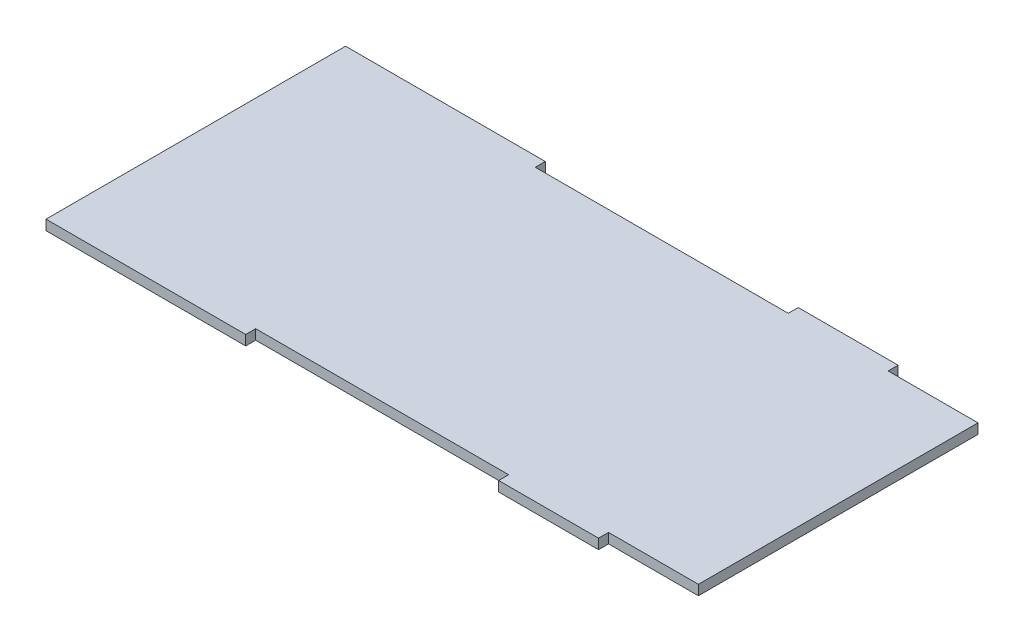
ISO-10303-21;
HEADER;
FILE_DESCRIPTION(('STEP AP214'),'2;1');
FILE_NAME('part.step','',(''),(''),'','','');
FILE_SCHEMA(('AUTOMOTIVE_DESIGN { 1 0 10303 214 1 1 1 1 }'));
ENDSEC;
DATA;
#1=APPLICATION_CONTEXT('core data for automotive mechanical design processes');
#2=APPLICATION_PROTOCOL_DEFINITION('international standard','automotive_design',2000,#1);
#3=PRODUCT_CONTEXT('',#1,'mechanical');
#4=PRODUCT('Part','Part','',(#3));
#5=PRODUCT_RELATED_PRODUCT_CATEGORY('part','',(#4));
#6=PRODUCT_DEFINITION_FORMATION('','',#4);
#7=PRODUCT_DEFINITION_CONTEXT('part definition',#1,'design');
#8=PRODUCT_DEFINITION('design','',#6,#7);
#9=PRODUCT_DEFINITION_SHAPE('','',#8);
#10=(LENGTH_UNIT() NAMED_UNIT(*) SI_UNIT(.MILLI.,.METRE.));
#11=(NAMED_UNIT(*) PLANE_ANGLE_UNIT() SI_UNIT($,.RADIAN.));
#12=(NAMED_UNIT(*) SI_UNIT($,.STERADIAN.) SOLID_ANGLE_UNIT());
#13=UNCERTAINTY_MEASURE_WITH_UNIT(LENGTH_MEASURE(1.E-05),#10,'distance_accuracy_value','');
#14=(GEOMETRIC_REPRESENTATION_CONTEXT(3) GLOBAL_UNCERTAINTY_ASSIGNED_CONTEXT((#13)) GLOBAL_UNIT_ASSIGNED_CONTEXT((#10,
#11,#12)) REPRESENTATION_CONTEXT('',''));
#15=CARTESIAN_POINT('',(0.,0.,0.));
#16=DIRECTION('',(0.,0.,1.));
#17=DIRECTION('',(1.,0.,0.));
#18=AXIS2_PLACEMENT_3D('',#15,#16,#17);
#19=CARTESIAN_POINT('',(68.,3.,0.));
#20=DIRECTION('',(-1.,0.,0.));
#21=DIRECTION('',(0.,0.,1.));
#22=AXIS2_PLACEMENT_3D('',#19,#20,#21);
#23=PLANE('',#22);
#24=DIRECTION('',(0.,0.,-1.));
#25=VECTOR('',#24,1.);
#26=CARTESIAN_POINT('',(68.,0.,0.));
#27=LINE('',#26,#25);
#28=CARTESIAN_POINT('',(68.,0.,45.));
#29=VERTEX_POINT('',#28);
#30=CARTESIAN_POINT('',(68.,0.,42.));
#31=VERTEX_POINT('',#30);
#32=EDGE_CURVE('E180',#29,#31,#27,.T.);
#33=ORIENTED_EDGE('',*,*,#32,.T.);
#34=DIRECTION('',(0.,-1.,0.));
#35=VECTOR('',#34,1.);
#36=CARTESIAN_POINT('',(68.,3.,42.));
#37=LINE('',#36,#35);
#38=CARTESIAN_POINT('',(68.,3.,42.));
#39=VERTEX_POINT('',#38);
#40=EDGE_CURVE('E11',#39,#31,#37,.T.);
#41=ORIENTED_EDGE('',*,*,#40,.F.);
#42=DIRECTION('',(0.,0.,-1.));
#43=VECTOR('',#42,1.);
#44=CARTESIAN_POINT('',(68.,3.,0.));
#45=LINE('',#44,#43);
#46=CARTESIAN_POINT('',(68.,3.,45.));
#47=VERTEX_POINT('',#46);
#48=EDGE_CURVE('E288',#47,#39,#45,.T.);
#49=ORIENTED_EDGE('',*,*,#48,.F.);
#50=DIRECTION('',(0.,-1.,0.));
#51=VECTOR('',#50,1.);
#52=CARTESIAN_POINT('',(68.,3.,45.));
#53=LINE('',#52,#51);
#54=EDGE_CURVE('E175',#47,#29,#53,.T.);
#55=ORIENTED_EDGE('',*,*,#54,.T.);
#56=EDGE_LOOP('',(#33,#41,#49,#55));
#57=FACE_BOUND('',#56,.T.);
#58=ADVANCED_FACE('F35',(#57),#23,.F.);
#59=CARTESIAN_POINT('',(0.,3.,42.));
#60=DIRECTION('',(0.,0.,-1.));
#61=DIRECTION('',(-1.,0.,0.));
#62=AXIS2_PLACEMENT_3D('',#59,#60,#61);
#63=PLANE('',#62);
#64=DIRECTION('',(1.,0.,0.));
#65=VECTOR('',#64,1.);
#66=CARTESIAN_POINT('',(0.,0.,42.));
#67=LINE('',#66,#65);
#68=CARTESIAN_POINT('',(95.,0.,42.));
#69=VERTEX_POINT('',#68);
#70=EDGE_CURVE('E183',#31,#69,#67,.T.);
#71=ORIENTED_EDGE('',*,*,#70,.T.);
#72=DIRECTION('',(0.,-1.,0.));
#73=VECTOR('',#72,1.);
#74=CARTESIAN_POINT('',(95.,3.,42.));
#75=LINE('',#74,#73);
#76=CARTESIAN_POINT('',(95.,3.,42.));
#77=VERTEX_POINT('',#76);
#78=EDGE_CURVE('E43',#77,#69,#75,.T.);
#79=ORIENTED_EDGE('',*,*,#78,.F.);
#80=DIRECTION('',(1.,0.,0.));
#81=VECTOR('',#80,1.);
#82=CARTESIAN_POINT('',(0.,3.,42.));
#83=LINE('',#82,#81);
#84=EDGE_CURVE('E118',#39,#77,#83,.T.);
#85=ORIENTED_EDGE('',*,*,#84,.F.);
#86=ORIENTED_EDGE('',*,*,#40,.T.);
#87=EDGE_LOOP('',(#71,#79,#85,#86));
#88=FACE_BOUND('',#87,.T.);
#89=ADVANCED_FACE('F294',(#88),#63,.F.);
#90=CARTESIAN_POINT('',(95.,3.,0.));
#91=DIRECTION('',(-1.,0.,0.));
#92=DIRECTION('',(0.,0.,1.));
#93=AXIS2_PLACEMENT_3D('',#90,#91,#92);
#94=PLANE('',#93);
#95=DIRECTION('',(0.,0.,-1.));
#96=VECTOR('',#95,1.);
#97=CARTESIAN_POINT('',(95.,0.,0.));
#98=LINE('',#97,#96);
#99=CARTESIAN_POINT('',(95.,0.,-42.));
#100=VERTEX_POINT('',#99);
#101=EDGE_CURVE('E185',#69,#100,#98,.T.);
#102=ORIENTED_EDGE('',*,*,#101,.T.);
#103=DIRECTION('',(0.,-1.,0.));
#104=VECTOR('',#103,1.);
#105=CARTESIAN_POINT('',(95.,3.,-42.));
#106=LINE('',#105,#104);
#107=CARTESIAN_POINT('',(95.,3.,-42.));
#108=VERTEX_POINT('',#107);
#109=EDGE_CURVE('E237',#108,#100,#106,.T.);
#110=ORIENTED_EDGE('',*,*,#109,.F.);
#111=DIRECTION('',(0.,0.,-1.));
#112=VECTOR('',#111,1.);
#113=CARTESIAN_POINT('',(95.,3.,0.));
#114=LINE('',#113,#112);
#115=EDGE_CURVE('E245',#77,#108,#114,.T.);
#116=ORIENTED_EDGE('',*,*,#115,.F.);
#117=ORIENTED_EDGE('',*,*,#78,.T.);
#118=EDGE_LOOP('',(#102,#110,#116,#117));
#119=FACE_BOUND('',#118,.T.);
#120=ADVANCED_FACE('F243',(#119),#94,.F.);
#121=CARTESIAN_POINT('',(0.,3.,-42.));
#122=DIRECTION('',(0.,0.,1.));
#123=DIRECTION('',(1.,0.,0.));
#124=AXIS2_PLACEMENT_3D('',#121,#122,#123);
#125=PLANE('',#124);
#126=DIRECTION('',(-1.,0.,0.));
#127=VECTOR('',#126,1.);
#128=CARTESIAN_POINT('',(0.,0.,-42.));
#129=LINE('',#128,#127);
#130=CARTESIAN_POINT('',(68.,0.,-42.));
#131=VERTEX_POINT('',#130);
#132=EDGE_CURVE('E187',#100,#131,#129,.T.);
#133=ORIENTED_EDGE('',*,*,#132,.T.);
#134=DIRECTION('',(0.,-1.,0.));
#135=VECTOR('',#134,1.);
#136=CARTESIAN_POINT('',(68.,3.,-42.));
#137=LINE('',#136,#135);
#138=CARTESIAN_POINT('',(68.,3.,-42.));
#139=VERTEX_POINT('',#138);
#140=EDGE_CURVE('E234',#139,#131,#137,.T.);
#141=ORIENTED_EDGE('',*,*,#140,.F.);
#142=DIRECTION('',(-1.,0.,0.));
#143=VECTOR('',#142,1.);
#144=CARTESIAN_POINT('',(0.,3.,-42.));
#145=LINE('',#144,#143);
#146=EDGE_CURVE('E263',#108,#139,#145,.T.);
#147=ORIENTED_EDGE('',*,*,#146,.F.);
#148=ORIENTED_EDGE('',*,*,#109,.T.);
#149=EDGE_LOOP('',(#133,#141,#147,#148));
#150=FACE_BOUND('',#149,.T.);
#151=ADVANCED_FACE('F253',(#150),#125,.F.);
#152=CARTESIAN_POINT('',(68.,3.,0.));
#153=DIRECTION('',(-1.,0.,0.));
#154=DIRECTION('',(0.,0.,1.));
#155=AXIS2_PLACEMENT_3D('',#152,#153,#154);
#156=PLANE('',#155);
#157=DIRECTION('',(0.,0.,-1.));
#158=VECTOR('',#157,1.);
#159=CARTESIAN_POINT('',(68.,0.,0.));
#160=LINE('',#159,#158);
#161=CARTESIAN_POINT('',(68.,0.,-45.));
#162=VERTEX_POINT('',#161);
#163=EDGE_CURVE('E189',#131,#162,#160,.T.);
#164=ORIENTED_EDGE('',*,*,#163,.T.);
#165=DIRECTION('',(0.,-1.,0.));
#166=VECTOR('',#165,1.);
#167=CARTESIAN_POINT('',(68.,3.,-45.));
#168=LINE('',#167,#166);
#169=CARTESIAN_POINT('',(68.,3.,-45.));
#170=VERTEX_POINT('',#169);
#171=EDGE_CURVE('E232',#170,#162,#168,.T.);
#172=ORIENTED_EDGE('',*,*,#171,.F.);
#173=DIRECTION('',(0.,0.,-1.));
#174=VECTOR('',#173,1.);
#175=CARTESIAN_POINT('',(68.,3.,0.));
#176=LINE('',#175,#174);
#177=EDGE_CURVE('E259',#139,#170,#176,.T.);
#178=ORIENTED_EDGE('',*,*,#177,.F.);
#179=ORIENTED_EDGE('',*,*,#140,.T.);
#180=EDGE_LOOP('',(#164,#172,#178,#179));
#181=FACE_BOUND('',#180,.T.);
#182=ADVANCED_FACE('F257',(#181),#156,.F.);
#183=CARTESIAN_POINT('',(0.,3.,-45.));
#184=DIRECTION('',(0.,0.,-1.));
#185=DIRECTION('',(-1.,0.,0.));
#186=AXIS2_PLACEMENT_3D('',#183,#184,#185);
#187=PLANE('',#186);
#188=DIRECTION('',(1.,0.,0.));
#189=VECTOR('',#188,1.);
#190=CARTESIAN_POINT('',(0.,0.,-45.));
#191=LINE('',#190,#189);
#192=CARTESIAN_POINT('',(38.,0.,-45.));
#193=VERTEX_POINT('',#192);
#194=EDGE_CURVE('E192',#193,#162,#191,.T.);
#195=ORIENTED_EDGE('',*,*,#194,.F.);
#196=DIRECTION('',(0.,-1.,0.));
#197=VECTOR('',#196,1.);
#198=CARTESIAN_POINT('',(38.,3.,-45.));
#199=LINE('',#198,#197);
#200=CARTESIAN_POINT('',(38.,3.,-45.));
#201=VERTEX_POINT('',#200);
#202=EDGE_CURVE('E230',#201,#193,#199,.T.);
#203=ORIENTED_EDGE('',*,*,#202,.F.);
#204=DIRECTION('',(1.,0.,0.));
#205=VECTOR('',#204,1.);
#206=CARTESIAN_POINT('',(0.,3.,-45.));
#207=LINE('',#206,#205);
#208=EDGE_CURVE('E262',#201,#170,#207,.T.);
#209=ORIENTED_EDGE('',*,*,#208,.T.);
#210=ORIENTED_EDGE('',*,*,#171,.T.);
#211=EDGE_LOOP('',(#195,#203,#209,#210));
#212=FACE_BOUND('',#211,.T.);
#213=ADVANCED_FACE('F306',(#212),#187,.T.);
#214=CARTESIAN_POINT('',(38.,3.,0.));
#215=DIRECTION('',(1.,0.,0.));
#216=DIRECTION('',(0.,0.,-1.));
#217=AXIS2_PLACEMENT_3D('',#214,#215,#216);
#218=PLANE('',#217);
#219=DIRECTION('',(0.,0.,1.));
#220=VECTOR('',#219,1.);
#221=CARTESIAN_POINT('',(38.,0.,0.));
#222=LINE('',#221,#220);
#223=CARTESIAN_POINT('',(38.,0.,-42.));
#224=VERTEX_POINT('',#223);
#225=EDGE_CURVE('E195',#193,#224,#222,.T.);
#226=ORIENTED_EDGE('',*,*,#225,.T.);
#227=DIRECTION('',(0.,-1.,0.));
#228=VECTOR('',#227,1.);
#229=CARTESIAN_POINT('',(38.,3.,-42.));
#230=LINE('',#229,#228);
#231=CARTESIAN_POINT('',(38.,3.,-42.));
#232=VERTEX_POINT('',#231);
#233=EDGE_CURVE('E227',#232,#224,#230,.T.);
#234=ORIENTED_EDGE('',*,*,#233,.F.);
#235=DIRECTION('',(0.,0.,1.));
#236=VECTOR('',#235,1.);
#237=CARTESIAN_POINT('',(38.,3.,0.));
#238=LINE('',#237,#236);
#239=EDGE_CURVE('E265',#201,#232,#238,.T.);
#240=ORIENTED_EDGE('',*,*,#239,.F.);
#241=ORIENTED_EDGE('',*,*,#202,.T.);
#242=EDGE_LOOP('',(#226,#234,#240,#241));
#243=FACE_BOUND('',#242,.T.);
#244=ADVANCED_FACE('F307',(#243),#218,.F.);
#245=CARTESIAN_POINT('',(0.,3.,-42.));
#246=DIRECTION('',(0.,0.,1.));
#247=DIRECTION('',(1.,0.,0.));
#248=AXIS2_PLACEMENT_3D('',#245,#246,#247);
#249=PLANE('',#248);
#250=DIRECTION('',(-1.,0.,0.));
#251=VECTOR('',#250,1.);
#252=CARTESIAN_POINT('',(0.,0.,-42.));
#253=LINE('',#252,#251);
#254=CARTESIAN_POINT('',(-38.,0.,-42.));
#255=VERTEX_POINT('',#254);
#256=EDGE_CURVE('E198',#224,#255,#253,.T.);
#257=ORIENTED_EDGE('',*,*,#256,.T.);
#258=DIRECTION('',(0.,-1.,0.));
#259=VECTOR('',#258,1.);
#260=CARTESIAN_POINT('',(-38.,3.,-42.));
#261=LINE('',#260,#259);
#262=CARTESIAN_POINT('',(-38.,3.,-42.));
#263=VERTEX_POINT('',#262);
#264=EDGE_CURVE('E224',#263,#255,#261,.T.);
#265=ORIENTED_EDGE('',*,*,#264,.F.);
#266=DIRECTION('',(-1.,0.,0.));
#267=VECTOR('',#266,1.);
#268=CARTESIAN_POINT('',(0.,3.,-42.));
#269=LINE('',#268,#267);
#270=EDGE_CURVE('E272',#232,#263,#269,.T.);
#271=ORIENTED_EDGE('',*,*,#270,.F.);
#272=ORIENTED_EDGE('',*,*,#233,.T.);
#273=EDGE_LOOP('',(#257,#265,#271,#272));
#274=FACE_BOUND('',#273,.T.);
#275=ADVANCED_FACE('F310',(#274),#249,.F.);
#276=CARTESIAN_POINT('',(-38.,3.,0.));
#277=DIRECTION('',(-1.,0.,0.));
#278=DIRECTION('',(0.,0.,1.));
#279=AXIS2_PLACEMENT_3D('',#276,#277,#278);
#280=PLANE('',#279);
#281=DIRECTION('',(0.,0.,-1.));
#282=VECTOR('',#281,1.);
#283=CARTESIAN_POINT('',(-38.,0.,0.));
#284=LINE('',#283,#282);
#285=CARTESIAN_POINT('',(-38.,0.,-45.));
#286=VERTEX_POINT('',#285);
#287=EDGE_CURVE('E200',#255,#286,#284,.T.);
#288=ORIENTED_EDGE('',*,*,#287,.T.);
#289=DIRECTION('',(0.,-1.,0.));
#290=VECTOR('',#289,1.);
#291=CARTESIAN_POINT('',(-38.,3.,-45.));
#292=LINE('',#291,#290);
#293=CARTESIAN_POINT('',(-38.,3.,-45.));
#294=VERTEX_POINT('',#293);
#295=EDGE_CURVE('E222',#294,#286,#292,.T.);
#296=ORIENTED_EDGE('',*,*,#295,.F.);
#297=DIRECTION('',(0.,0.,-1.));
#298=VECTOR('',#297,1.);
#299=CARTESIAN_POINT('',(-38.,3.,0.));
#300=LINE('',#299,#298);
#301=EDGE_CURVE('E274',#263,#294,#300,.T.);
#302=ORIENTED_EDGE('',*,*,#301,.F.);
#303=ORIENTED_EDGE('',*,*,#264,.T.);
#304=EDGE_LOOP('',(#288,#296,#302,#303));
#305=FACE_BOUND('',#304,.T.);
#306=ADVANCED_FACE('F314',(#305),#280,.F.);
#307=CARTESIAN_POINT('',(-98.,0.,-45.));
#308=VERTEX_POINT('',#307);
#309=EDGE_CURVE('E196',#308,#286,#191,.T.);
#310=ORIENTED_EDGE('',*,*,#309,.F.);
#311=DIRECTION('',(0.,-1.,0.));
#312=VECTOR('',#311,1.);
#313=CARTESIAN_POINT('',(-98.,3.,-45.));
#314=LINE('',#313,#312);
#315=CARTESIAN_POINT('',(-98.,3.,-45.));
#316=VERTEX_POINT('',#315);
#317=EDGE_CURVE('E220',#316,#308,#314,.T.);
#318=ORIENTED_EDGE('',*,*,#317,.F.);
#319=EDGE_CURVE('E267',#316,#294,#207,.T.);
#320=ORIENTED_EDGE('',*,*,#319,.T.);
#321=ORIENTED_EDGE('',*,*,#295,.T.);
#322=EDGE_LOOP('',(#310,#318,#320,#321));
#323=FACE_BOUND('',#322,.T.);
#324=ADVANCED_FACE('F318',(#323),#187,.T.);
#325=CARTESIAN_POINT('',(-98.,3.,0.));
#326=DIRECTION('',(-1.,0.,0.));
#327=DIRECTION('',(0.,0.,1.));
#328=AXIS2_PLACEMENT_3D('',#325,#326,#327);
#329=PLANE('',#328);
#330=DIRECTION('',(0.,0.,-1.));
#331=VECTOR('',#330,1.);
#332=CARTESIAN_POINT('',(-98.,0.,0.));
#333=LINE('',#332,#331);
#334=CARTESIAN_POINT('',(-98.,0.,45.));
#335=VERTEX_POINT('',#334);
#336=EDGE_CURVE('E203',#335,#308,#333,.T.);
#337=ORIENTED_EDGE('',*,*,#336,.F.);
#338=DIRECTION('',(0.,-1.,0.));
#339=VECTOR('',#338,1.);
#340=CARTESIAN_POINT('',(-98.,3.,45.));
#341=LINE('',#340,#339);
#342=CARTESIAN_POINT('',(-98.,3.,45.));
#343=VERTEX_POINT('',#342);
#344=EDGE_CURVE('E218',#343,#335,#341,.T.);
#345=ORIENTED_EDGE('',*,*,#344,.F.);
#346=DIRECTION('',(0.,0.,-1.));
#347=VECTOR('',#346,1.);
#348=CARTESIAN_POINT('',(-98.,3.,0.));
#349=LINE('',#348,#347);
#350=EDGE_CURVE('E276',#343,#316,#349,.T.);
#351=ORIENTED_EDGE('',*,*,#350,.T.);
#352=ORIENTED_EDGE('',*,*,#317,.T.);
#353=EDGE_LOOP('',(#337,#345,#351,#352));
#354=FACE_BOUND('',#353,.T.);
#355=ADVANCED_FACE('F322',(#354),#329,.T.);
#356=CARTESIAN_POINT('',(0.,3.,45.));
#357=DIRECTION('',(0.,0.,-1.));
#358=DIRECTION('',(-1.,0.,0.));
#359=AXIS2_PLACEMENT_3D('',#356,#357,#358);
#360=PLANE('',#359);
#361=DIRECTION('',(1.,0.,0.));
#362=VECTOR('',#361,1.);
#363=CARTESIAN_POINT('',(0.,0.,45.));
#364=LINE('',#363,#362);
#365=CARTESIAN_POINT('',(-38.,0.,45.));
#366=VERTEX_POINT('',#365);
#367=EDGE_CURVE('E206',#335,#366,#364,.T.);
#368=ORIENTED_EDGE('',*,*,#367,.T.);
#369=DIRECTION('',(0.,-1.,0.));
#370=VECTOR('',#369,1.);
#371=CARTESIAN_POINT('',(-38.,3.,45.));
#372=LINE('',#371,#370);
#373=CARTESIAN_POINT('',(-38.,3.,45.));
#374=VERTEX_POINT('',#373);
#375=EDGE_CURVE('E215',#374,#366,#372,.T.);
#376=ORIENTED_EDGE('',*,*,#375,.F.);
#377=DIRECTION('',(1.,0.,0.));
#378=VECTOR('',#377,1.);
#379=CARTESIAN_POINT('',(0.,3.,45.));
#380=LINE('',#379,#378);
#381=EDGE_CURVE('E177',#343,#374,#380,.T.);
#382=ORIENTED_EDGE('',*,*,#381,.F.);
#383=ORIENTED_EDGE('',*,*,#344,.T.);
#384=EDGE_LOOP('',(#368,#376,#382,#383));
#385=FACE_BOUND('',#384,.T.);
#386=ADVANCED_FACE('F283',(#385),#360,.F.);
#387=CARTESIAN_POINT('',(-38.,3.,0.));
#388=DIRECTION('',(-1.,0.,0.));
#389=DIRECTION('',(0.,0.,1.));
#390=AXIS2_PLACEMENT_3D('',#387,#388,#389);
#391=PLANE('',#390);
#392=DIRECTION('',(0.,0.,-1.));
#393=VECTOR('',#392,1.);
#394=CARTESIAN_POINT('',(-38.,0.,0.));
#395=LINE('',#394,#393);
#396=CARTESIAN_POINT('',(-38.,0.,42.));
#397=VERTEX_POINT('',#396);
#398=EDGE_CURVE('E208',#366,#397,#395,.T.);
#399=ORIENTED_EDGE('',*,*,#398,.T.);
#400=DIRECTION('',(0.,-1.,0.));
#401=VECTOR('',#400,1.);
#402=CARTESIAN_POINT('',(-38.,3.,42.));
#403=LINE('',#402,#401);
#404=CARTESIAN_POINT('',(-38.,3.,42.));
#405=VERTEX_POINT('',#404);
#406=EDGE_CURVE('E170',#405,#397,#403,.T.);
#407=ORIENTED_EDGE('',*,*,#406,.F.);
#408=DIRECTION('',(0.,0.,-1.));
#409=VECTOR('',#408,1.);
#410=CARTESIAN_POINT('',(-38.,3.,0.));
#411=LINE('',#410,#409);
#412=EDGE_CURVE('E161',#374,#405,#411,.T.);
#413=ORIENTED_EDGE('',*,*,#412,.F.);
#414=ORIENTED_EDGE('',*,*,#375,.T.);
#415=EDGE_LOOP('',(#399,#407,#413,#414));
#416=FACE_BOUND('',#415,.T.);
#417=ADVANCED_FACE('F287',(#416),#391,.F.);
#418=CARTESIAN_POINT('',(0.,3.,42.));
#419=DIRECTION('',(0.,0.,-1.));
#420=DIRECTION('',(-1.,0.,0.));
#421=AXIS2_PLACEMENT_3D('',#418,#419,#420);
#422=PLANE('',#421);
#423=DIRECTION('',(1.,0.,0.));
#424=VECTOR('',#423,1.);
#425=CARTESIAN_POINT('',(0.,0.,42.));
#426=LINE('',#425,#424);
#427=CARTESIAN_POINT('',(38.,0.,42.));
#428=VERTEX_POINT('',#427);
#429=EDGE_CURVE('E169',#397,#428,#426,.T.);
#430=ORIENTED_EDGE('',*,*,#429,.T.);
#431=DIRECTION('',(0.,-1.,0.));
#432=VECTOR('',#431,1.);
#433=CARTESIAN_POINT('',(38.,3.,42.));
#434=LINE('',#433,#432);
#435=CARTESIAN_POINT('',(38.,3.,42.));
#436=VERTEX_POINT('',#435);
#437=EDGE_CURVE('E166',#436,#428,#434,.T.);
#438=ORIENTED_EDGE('',*,*,#437,.F.);
#439=DIRECTION('',(1.,0.,0.));
#440=VECTOR('',#439,1.);
#441=CARTESIAN_POINT('',(0.,3.,42.));
#442=LINE('',#441,#440);
#443=EDGE_CURVE('E155',#405,#436,#442,.T.);
#444=ORIENTED_EDGE('',*,*,#443,.F.);
#445=ORIENTED_EDGE('',*,*,#406,.T.);
#446=EDGE_LOOP('',(#430,#438,#444,#445));
#447=FACE_BOUND('',#446,.T.);
#448=ADVANCED_FACE('F167',(#447),#422,.F.);
#449=CARTESIAN_POINT('',(38.,3.,0.));
#450=DIRECTION('',(1.,0.,0.));
#451=DIRECTION('',(0.,0.,-1.));
#452=AXIS2_PLACEMENT_3D('',#449,#450,#451);
#453=PLANE('',#452);
#454=DIRECTION('',(0.,0.,1.));
#455=VECTOR('',#454,1.);
#456=CARTESIAN_POINT('',(38.,0.,0.));
#457=LINE('',#456,#455);
#458=CARTESIAN_POINT('',(38.,0.,45.));
#459=VERTEX_POINT('',#458);
#460=EDGE_CURVE('E104',#428,#459,#457,.T.);
#461=ORIENTED_EDGE('',*,*,#460,.T.);
#462=DIRECTION('',(0.,-1.,0.));
#463=VECTOR('',#462,1.);
#464=CARTESIAN_POINT('',(38.,3.,45.));
#465=LINE('',#464,#463);
#466=CARTESIAN_POINT('',(38.,3.,45.));
#467=VERTEX_POINT('',#466);
#468=EDGE_CURVE('E171',#467,#459,#465,.T.);
#469=ORIENTED_EDGE('',*,*,#468,.F.);
#470=DIRECTION('',(0.,0.,1.));
#471=VECTOR('',#470,1.);
#472=CARTESIAN_POINT('',(38.,3.,0.));
#473=LINE('',#472,#471);
#474=EDGE_CURVE('E159',#436,#467,#473,.T.);
#475=ORIENTED_EDGE('',*,*,#474,.F.);
#476=ORIENTED_EDGE('',*,*,#437,.T.);
#477=EDGE_LOOP('',(#461,#469,#475,#476));
#478=FACE_BOUND('',#477,.T.);
#479=ADVANCED_FACE('F173',(#478),#453,.F.);
#480=EDGE_CURVE('E110',#459,#29,#364,.T.);
#481=ORIENTED_EDGE('',*,*,#480,.T.);
#482=ORIENTED_EDGE('',*,*,#54,.F.);
#483=EDGE_CURVE('E51',#467,#47,#380,.T.);
#484=ORIENTED_EDGE('',*,*,#483,.F.);
#485=ORIENTED_EDGE('',*,*,#468,.T.);
#486=EDGE_LOOP('',(#481,#482,#484,#485));
#487=FACE_BOUND('',#486,.T.);
#488=ADVANCED_FACE('F333',(#487),#360,.F.);
#489=CARTESIAN_POINT('',(0.,3.,0.));
#490=DIRECTION('',(0.,1.,0.));
#491=DIRECTION('',(0.,0.,1.));
#492=AXIS2_PLACEMENT_3D('',#489,#490,#491);
#493=PLANE('',#492);
#494=ORIENTED_EDGE('',*,*,#48,.T.);
#495=ORIENTED_EDGE('',*,*,#84,.T.);
#496=ORIENTED_EDGE('',*,*,#115,.T.);
#497=ORIENTED_EDGE('',*,*,#146,.T.);
#498=ORIENTED_EDGE('',*,*,#177,.T.);
#499=ORIENTED_EDGE('',*,*,#208,.F.);
#500=ORIENTED_EDGE('',*,*,#239,.T.);
#501=ORIENTED_EDGE('',*,*,#270,.T.);
#502=ORIENTED_EDGE('',*,*,#301,.T.);
#503=ORIENTED_EDGE('',*,*,#319,.F.);
#504=ORIENTED_EDGE('',*,*,#350,.F.);
#505=ORIENTED_EDGE('',*,*,#381,.T.);
#506=ORIENTED_EDGE('',*,*,#412,.T.);
#507=ORIENTED_EDGE('',*,*,#443,.T.);
#508=ORIENTED_EDGE('',*,*,#474,.T.);
#509=ORIENTED_EDGE('',*,*,#483,.T.);
#510=EDGE_LOOP('',(#494,#495,#496,#497,#498,#499,#500,#501,#502,#503,#504,#505,#506,#507,#508,#509));
#511=FACE_BOUND('',#510,.T.);
#512=ADVANCED_FACE('F157',(#511),#493,.T.);
#513=CARTESIAN_POINT('',(0.,0.,0.));
#514=DIRECTION('',(0.,1.,0.));
#515=DIRECTION('',(0.,0.,1.));
#516=AXIS2_PLACEMENT_3D('',#513,#514,#515);
#517=PLANE('',#516);
#518=ORIENTED_EDGE('',*,*,#32,.F.);
#519=ORIENTED_EDGE('',*,*,#480,.F.);
#520=ORIENTED_EDGE('',*,*,#460,.F.);
#521=ORIENTED_EDGE('',*,*,#429,.F.);
#522=ORIENTED_EDGE('',*,*,#398,.F.);
#523=ORIENTED_EDGE('',*,*,#367,.F.);
#524=ORIENTED_EDGE('',*,*,#336,.T.);
#525=ORIENTED_EDGE('',*,*,#309,.T.);
#526=ORIENTED_EDGE('',*,*,#287,.F.);
#527=ORIENTED_EDGE('',*,*,#256,.F.);
#528=ORIENTED_EDGE('',*,*,#225,.F.);
#529=ORIENTED_EDGE('',*,*,#194,.T.);
#530=ORIENTED_EDGE('',*,*,#163,.F.);
#531=ORIENTED_EDGE('',*,*,#132,.F.);
#532=ORIENTED_EDGE('',*,*,#101,.F.);
#533=ORIENTED_EDGE('',*,*,#70,.F.);
#534=EDGE_LOOP('',(#518,#519,#520,#521,#522,#523,#524,#525,#526,#527,#528,#529,#530,#531,#532,#533));
#535=FACE_BOUND('',#534,.T.);
#536=ADVANCED_FACE('F249',(#535),#517,.F.);
#537=CLOSED_SHELL('',(#58,#89,#120,#151,#182,#213,#244,#275,#306,#324,#355,#386,#417,#448,#479,
#488,#512,#536));
#538=MANIFOLD_SOLID_BREP('B2',#537);
#539=ADVANCED_BREP_SHAPE_REPRESENTATION('',(#18,#538),#14);
#540=SHAPE_DEFINITION_REPRESENTATION(#9,#539);
ENDSEC;
END-ISO-10303-21;
